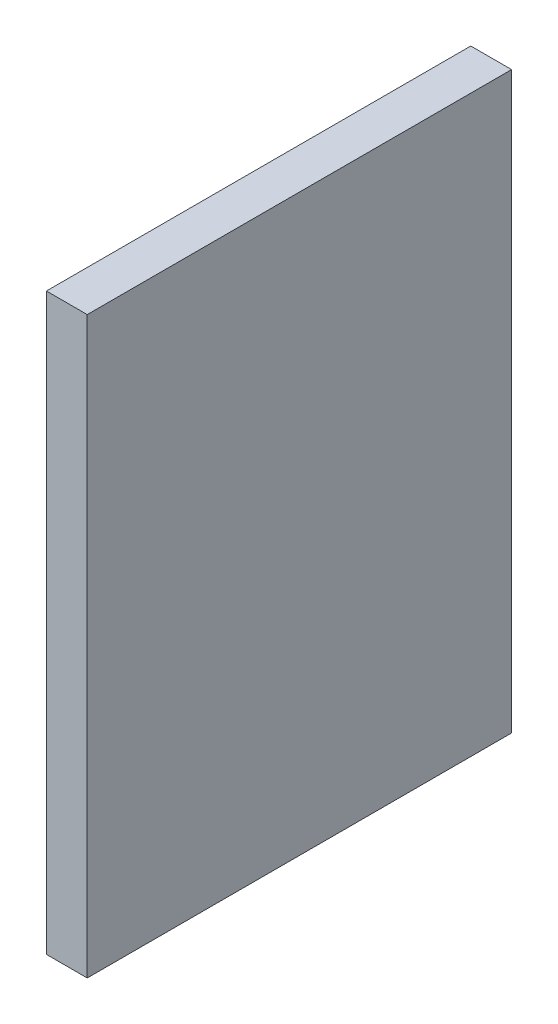
ISO-10303-21;
HEADER;
FILE_DESCRIPTION(('STEP AP214'),'2;1');
FILE_NAME('part.step','',(''),(''),'','','');
FILE_SCHEMA(('AUTOMOTIVE_DESIGN { 1 0 10303 214 1 1 1 1 }'));
ENDSEC;
DATA;
#1=APPLICATION_CONTEXT('core data for automotive mechanical design processes');
#2=APPLICATION_PROTOCOL_DEFINITION('international standard','automotive_design',2000,#1);
#3=PRODUCT_CONTEXT('',#1,'mechanical');
#4=PRODUCT('Part','Part','',(#3));
#5=PRODUCT_RELATED_PRODUCT_CATEGORY('part','',(#4));
#6=PRODUCT_DEFINITION_FORMATION('','',#4);
#7=PRODUCT_DEFINITION_CONTEXT('part definition',#1,'design');
#8=PRODUCT_DEFINITION('design','',#6,#7);
#9=PRODUCT_DEFINITION_SHAPE('','',#8);
#10=(LENGTH_UNIT() NAMED_UNIT(*) SI_UNIT(.MILLI.,.METRE.));
#11=(NAMED_UNIT(*) PLANE_ANGLE_UNIT() SI_UNIT($,.RADIAN.));
#12=(NAMED_UNIT(*) SI_UNIT($,.STERADIAN.) SOLID_ANGLE_UNIT());
#13=UNCERTAINTY_MEASURE_WITH_UNIT(LENGTH_MEASURE(1.E-05),#10,'distance_accuracy_value','');
#14=(GEOMETRIC_REPRESENTATION_CONTEXT(3) GLOBAL_UNCERTAINTY_ASSIGNED_CONTEXT((#13)) GLOBAL_UNIT_ASSIGNED_CONTEXT((#10,
#11,#12)) REPRESENTATION_CONTEXT('',''));
#15=CARTESIAN_POINT('',(0.,0.,0.));
#16=DIRECTION('',(0.,0.,1.));
#17=DIRECTION('',(1.,0.,0.));
#18=AXIS2_PLACEMENT_3D('',#15,#16,#17);
#19=CARTESIAN_POINT('',(-20.,0.,0.));
#20=DIRECTION('',(1.,0.,0.));
#21=DIRECTION('',(0.,1.,0.));
#22=AXIS2_PLACEMENT_3D('',#19,#20,#21);
#23=PLANE('',#22);
#24=DIRECTION('',(0.,0.,-1.));
#25=VECTOR('',#24,1.);
#26=CARTESIAN_POINT('',(-20.,-9.85,9.7));
#27=LINE('',#26,#25);
#28=CARTESIAN_POINT('',(-20.,-9.85,9.7));
#29=VERTEX_POINT('',#28);
#30=CARTESIAN_POINT('',(-20.,-9.85,-4.85));
#31=VERTEX_POINT('',#30);
#32=EDGE_CURVE('E84',#29,#31,#27,.T.);
#33=ORIENTED_EDGE('',*,*,#32,.F.);
#34=DIRECTION('',(0.,-1.,0.));
#35=VECTOR('',#34,1.);
#36=CARTESIAN_POINT('',(-20.,9.85,9.7));
#37=LINE('',#36,#35);
#38=CARTESIAN_POINT('',(-20.,9.85,9.7));
#39=VERTEX_POINT('',#38);
#40=EDGE_CURVE('E26',#39,#29,#37,.T.);
#41=ORIENTED_EDGE('',*,*,#40,.F.);
#42=DIRECTION('',(0.,0.,1.));
#43=VECTOR('',#42,1.);
#44=CARTESIAN_POINT('',(-20.,9.85,-4.85));
#45=LINE('',#44,#43);
#46=CARTESIAN_POINT('',(-20.,9.85,-4.85));
#47=VERTEX_POINT('',#46);
#48=EDGE_CURVE('E107',#47,#39,#45,.T.);
#49=ORIENTED_EDGE('',*,*,#48,.F.);
#50=DIRECTION('',(0.,1.,0.));
#51=VECTOR('',#50,1.);
#52=CARTESIAN_POINT('',(-20.,-9.85,-4.85));
#53=LINE('',#52,#51);
#54=EDGE_CURVE('E88',#31,#47,#53,.T.);
#55=ORIENTED_EDGE('',*,*,#54,.F.);
#56=EDGE_LOOP('',(#33,#41,#49,#55));
#57=FACE_BOUND('',#56,.T.);
#58=ADVANCED_FACE('F17',(#57),#23,.F.);
#59=CARTESIAN_POINT('',(-18.6,0.,0.));
#60=DIRECTION('',(1.,0.,0.));
#61=DIRECTION('',(0.,1.,0.));
#62=AXIS2_PLACEMENT_3D('',#59,#60,#61);
#63=PLANE('',#62);
#64=DIRECTION('',(0.,0.,-1.));
#65=VECTOR('',#64,1.);
#66=CARTESIAN_POINT('',(-18.6,-9.85,9.7));
#67=LINE('',#66,#65);
#68=CARTESIAN_POINT('',(-18.6,-9.85,9.7));
#69=VERTEX_POINT('',#68);
#70=CARTESIAN_POINT('',(-18.6,-9.85,-4.85));
#71=VERTEX_POINT('',#70);
#72=EDGE_CURVE('E86',#69,#71,#67,.T.);
#73=ORIENTED_EDGE('',*,*,#72,.T.);
#74=DIRECTION('',(0.,1.,0.));
#75=VECTOR('',#74,1.);
#76=CARTESIAN_POINT('',(-18.6,-9.85,-4.85));
#77=LINE('',#76,#75);
#78=CARTESIAN_POINT('',(-18.6,9.85,-4.85));
#79=VERTEX_POINT('',#78);
#80=EDGE_CURVE('E110',#71,#79,#77,.T.);
#81=ORIENTED_EDGE('',*,*,#80,.T.);
#82=DIRECTION('',(0.,0.,1.));
#83=VECTOR('',#82,1.);
#84=CARTESIAN_POINT('',(-18.6,9.85,-4.85));
#85=LINE('',#84,#83);
#86=CARTESIAN_POINT('',(-18.6,9.85,9.7));
#87=VERTEX_POINT('',#86);
#88=EDGE_CURVE('E78',#79,#87,#85,.T.);
#89=ORIENTED_EDGE('',*,*,#88,.T.);
#90=DIRECTION('',(0.,-1.,0.));
#91=VECTOR('',#90,1.);
#92=CARTESIAN_POINT('',(-18.6,9.85,9.7));
#93=LINE('',#92,#91);
#94=EDGE_CURVE('E11',#87,#69,#93,.T.);
#95=ORIENTED_EDGE('',*,*,#94,.T.);
#96=EDGE_LOOP('',(#73,#81,#89,#95));
#97=FACE_BOUND('',#96,.T.);
#98=ADVANCED_FACE('F19',(#97),#63,.T.);
#99=CARTESIAN_POINT('',(-18.6,9.85,9.7));
#100=DIRECTION('',(0.,0.,-1.));
#101=DIRECTION('',(-1.,0.,0.));
#102=AXIS2_PLACEMENT_3D('',#99,#100,#101);
#103=PLANE('',#102);
#104=ORIENTED_EDGE('',*,*,#40,.T.);
#105=DIRECTION('',(-1.,0.,0.));
#106=VECTOR('',#105,1.);
#107=CARTESIAN_POINT('',(-18.6,-9.85,9.7));
#108=LINE('',#107,#106);
#109=EDGE_CURVE('E72',#69,#29,#108,.T.);
#110=ORIENTED_EDGE('',*,*,#109,.F.);
#111=ORIENTED_EDGE('',*,*,#94,.F.);
#112=DIRECTION('',(-1.,0.,0.));
#113=VECTOR('',#112,1.);
#114=CARTESIAN_POINT('',(-18.6,9.85,9.7));
#115=LINE('',#114,#113);
#116=EDGE_CURVE('E75',#87,#39,#115,.T.);
#117=ORIENTED_EDGE('',*,*,#116,.T.);
#118=EDGE_LOOP('',(#104,#110,#111,#117));
#119=FACE_BOUND('',#118,.T.);
#120=ADVANCED_FACE('F71',(#119),#103,.F.);
#121=CARTESIAN_POINT('',(-18.6,9.85,-4.85));
#122=DIRECTION('',(0.,-1.,0.));
#123=DIRECTION('',(0.,0.,-1.));
#124=AXIS2_PLACEMENT_3D('',#121,#122,#123);
#125=PLANE('',#124);
#126=ORIENTED_EDGE('',*,*,#48,.T.);
#127=ORIENTED_EDGE('',*,*,#116,.F.);
#128=ORIENTED_EDGE('',*,*,#88,.F.);
#129=DIRECTION('',(-1.,0.,0.));
#130=VECTOR('',#129,1.);
#131=CARTESIAN_POINT('',(-18.6,9.85,-4.85));
#132=LINE('',#131,#130);
#133=EDGE_CURVE('E101',#79,#47,#132,.T.);
#134=ORIENTED_EDGE('',*,*,#133,.T.);
#135=EDGE_LOOP('',(#126,#127,#128,#134));
#136=FACE_BOUND('',#135,.T.);
#137=ADVANCED_FACE('F122',(#136),#125,.F.);
#138=CARTESIAN_POINT('',(-18.6,-9.85,-4.85));
#139=DIRECTION('',(0.,0.,1.));
#140=DIRECTION('',(0.,-1.,0.));
#141=AXIS2_PLACEMENT_3D('',#138,#139,#140);
#142=PLANE('',#141);
#143=ORIENTED_EDGE('',*,*,#54,.T.);
#144=ORIENTED_EDGE('',*,*,#133,.F.);
#145=ORIENTED_EDGE('',*,*,#80,.F.);
#146=DIRECTION('',(-1.,0.,0.));
#147=VECTOR('',#146,1.);
#148=CARTESIAN_POINT('',(-18.6,-9.85,-4.85));
#149=LINE('',#148,#147);
#150=EDGE_CURVE('E93',#71,#31,#149,.T.);
#151=ORIENTED_EDGE('',*,*,#150,.T.);
#152=EDGE_LOOP('',(#143,#144,#145,#151));
#153=FACE_BOUND('',#152,.T.);
#154=ADVANCED_FACE('F125',(#153),#142,.F.);
#155=CARTESIAN_POINT('',(-18.6,-9.85,9.7));
#156=DIRECTION('',(0.,1.,0.));
#157=DIRECTION('',(0.,0.,-1.));
#158=AXIS2_PLACEMENT_3D('',#155,#156,#157);
#159=PLANE('',#158);
#160=ORIENTED_EDGE('',*,*,#32,.T.);
#161=ORIENTED_EDGE('',*,*,#150,.F.);
#162=ORIENTED_EDGE('',*,*,#72,.F.);
#163=ORIENTED_EDGE('',*,*,#109,.T.);
#164=EDGE_LOOP('',(#160,#161,#162,#163));
#165=FACE_BOUND('',#164,.T.);
#166=ADVANCED_FACE('F82',(#165),#159,.F.);
#167=CLOSED_SHELL('',(#58,#98,#120,#137,#154,#166));
#168=MANIFOLD_SOLID_BREP('B1',#167);
#169=ADVANCED_BREP_SHAPE_REPRESENTATION('',(#18,#168),#14);
#170=SHAPE_DEFINITION_REPRESENTATION(#9,#169);
ENDSEC;
END-ISO-10303-21;
